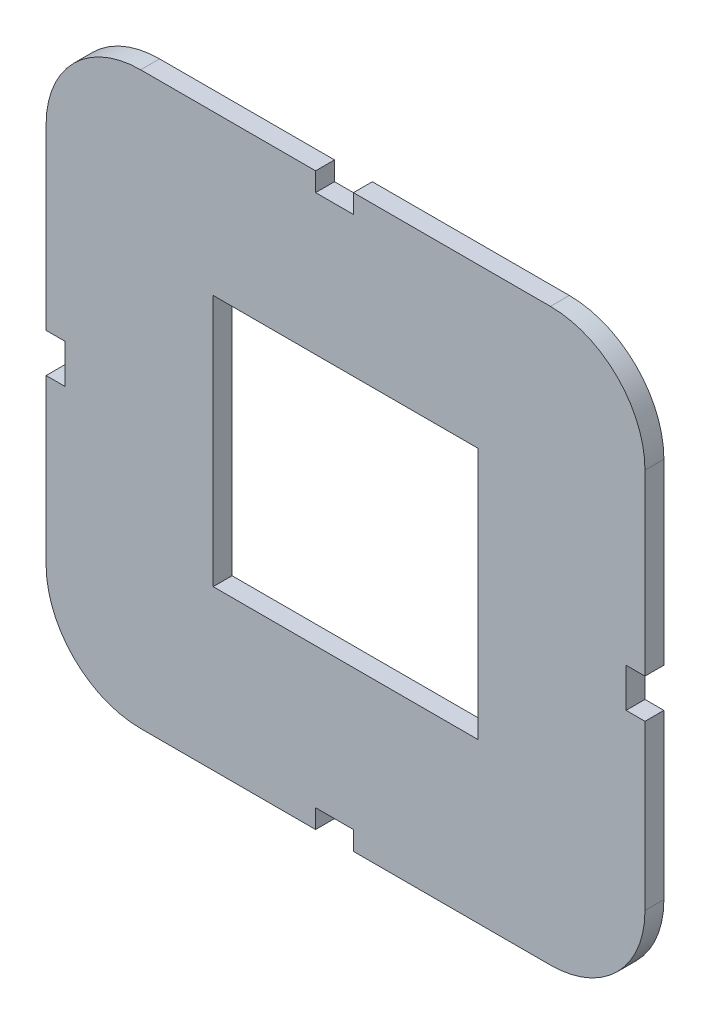
ISO-10303-21;
HEADER;
FILE_DESCRIPTION(('STEP AP214'),'2;1');
FILE_NAME('part.step','',(''),(''),'','','');
FILE_SCHEMA(('AUTOMOTIVE_DESIGN { 1 0 10303 214 1 1 1 1 }'));
ENDSEC;
DATA;
#1=APPLICATION_CONTEXT('core data for automotive mechanical design processes');
#2=APPLICATION_PROTOCOL_DEFINITION('international standard','automotive_design',2000,#1);
#3=PRODUCT_CONTEXT('',#1,'mechanical');
#4=PRODUCT('Part','Part','',(#3));
#5=PRODUCT_RELATED_PRODUCT_CATEGORY('part','',(#4));
#6=PRODUCT_DEFINITION_FORMATION('','',#4);
#7=PRODUCT_DEFINITION_CONTEXT('part definition',#1,'design');
#8=PRODUCT_DEFINITION('design','',#6,#7);
#9=PRODUCT_DEFINITION_SHAPE('','',#8);
#10=(LENGTH_UNIT() NAMED_UNIT(*) SI_UNIT(.MILLI.,.METRE.));
#11=(NAMED_UNIT(*) PLANE_ANGLE_UNIT() SI_UNIT($,.RADIAN.));
#12=(NAMED_UNIT(*) SI_UNIT($,.STERADIAN.) SOLID_ANGLE_UNIT());
#13=UNCERTAINTY_MEASURE_WITH_UNIT(LENGTH_MEASURE(1.E-05),#10,'distance_accuracy_value','');
#14=(GEOMETRIC_REPRESENTATION_CONTEXT(3) GLOBAL_UNCERTAINTY_ASSIGNED_CONTEXT((#13)) GLOBAL_UNIT_ASSIGNED_CONTEXT((#10,
#11,#12)) REPRESENTATION_CONTEXT('',''));
#15=CARTESIAN_POINT('',(0.,0.,0.));
#16=DIRECTION('',(0.,0.,1.));
#17=DIRECTION('',(1.,0.,0.));
#18=AXIS2_PLACEMENT_3D('',#15,#16,#17);
#19=CARTESIAN_POINT('',(-32.5,30.25,3.));
#20=DIRECTION('',(0.,0.,-1.));
#21=DIRECTION('',(-1.,0.,0.));
#22=AXIS2_PLACEMENT_3D('',#19,#20,#21);
#23=PLANE('',#22);
#24=DIRECTION('',(0.,-1.,0.));
#25=VECTOR('',#24,1.);
#26=CARTESIAN_POINT('',(-47.5,-30.2499999999999,3.));
#27=LINE('',#26,#25);
#28=CARTESIAN_POINT('',(-47.5,-4.25000000000001,3.));
#29=VERTEX_POINT('',#28);
#30=CARTESIAN_POINT('',(-47.5,-30.25,3.));
#31=VERTEX_POINT('',#30);
#32=EDGE_CURVE('E258',#29,#31,#27,.T.);
#33=ORIENTED_EDGE('',*,*,#32,.T.);
#34=CARTESIAN_POINT('',(-32.5,-30.25,3.));
#35=DIRECTION('',(0.,0.,1.));
#36=DIRECTION('',(-1.,0.,0.));
#37=AXIS2_PLACEMENT_3D('',#34,#35,#36);
#38=CIRCLE('',#37,15.);
#39=CARTESIAN_POINT('',(-32.4999999999999,-45.25,3.));
#40=VERTEX_POINT('',#39);
#41=EDGE_CURVE('E261',#31,#40,#38,.T.);
#42=ORIENTED_EDGE('',*,*,#41,.T.);
#43=DIRECTION('',(1.,0.,0.));
#44=VECTOR('',#43,1.);
#45=CARTESIAN_POINT('',(-32.4999999999999,-45.25,3.));
#46=LINE('',#45,#44);
#47=CARTESIAN_POINT('',(-4.75000000000001,-45.25,3.));
#48=VERTEX_POINT('',#47);
#49=EDGE_CURVE('E264',#40,#48,#46,.T.);
#50=ORIENTED_EDGE('',*,*,#49,.T.);
#51=DIRECTION('',(0.,1.,0.));
#52=VECTOR('',#51,1.);
#53=CARTESIAN_POINT('',(-4.75000000000001,-45.25,3.));
#54=LINE('',#53,#52);
#55=CARTESIAN_POINT('',(-4.75000000000001,-42.25,3.));
#56=VERTEX_POINT('',#55);
#57=EDGE_CURVE('E266',#48,#56,#54,.T.);
#58=ORIENTED_EDGE('',*,*,#57,.T.);
#59=DIRECTION('',(1.,0.,0.));
#60=VECTOR('',#59,1.);
#61=CARTESIAN_POINT('',(-4.75000000000001,-42.25,3.));
#62=LINE('',#61,#60);
#63=CARTESIAN_POINT('',(1.24999999999999,-42.25,3.));
#64=VERTEX_POINT('',#63);
#65=EDGE_CURVE('E268',#56,#64,#62,.T.);
#66=ORIENTED_EDGE('',*,*,#65,.T.);
#67=DIRECTION('',(0.,-1.,0.));
#68=VECTOR('',#67,1.);
#69=CARTESIAN_POINT('',(1.24999999999999,-42.25,3.));
#70=LINE('',#69,#68);
#71=CARTESIAN_POINT('',(1.24999999999999,-45.25,3.));
#72=VERTEX_POINT('',#71);
#73=EDGE_CURVE('E270',#64,#72,#70,.T.);
#74=ORIENTED_EDGE('',*,*,#73,.T.);
#75=DIRECTION('',(1.,0.,0.));
#76=VECTOR('',#75,1.);
#77=CARTESIAN_POINT('',(1.24999999999999,-45.25,3.));
#78=LINE('',#77,#76);
#79=CARTESIAN_POINT('',(32.4999999999999,-45.25,3.));
#80=VERTEX_POINT('',#79);
#81=EDGE_CURVE('E272',#72,#80,#78,.T.);
#82=ORIENTED_EDGE('',*,*,#81,.T.);
#83=CARTESIAN_POINT('',(32.5,-30.25,3.));
#84=DIRECTION('',(0.,0.,1.));
#85=DIRECTION('',(1.,0.,0.));
#86=AXIS2_PLACEMENT_3D('',#83,#84,#85);
#87=CIRCLE('',#86,15.);
#88=CARTESIAN_POINT('',(47.5,-30.2499999999999,3.));
#89=VERTEX_POINT('',#88);
#90=EDGE_CURVE('E274',#80,#89,#87,.T.);
#91=ORIENTED_EDGE('',*,*,#90,.T.);
#92=DIRECTION('',(0.,1.,0.));
#93=VECTOR('',#92,1.);
#94=CARTESIAN_POINT('',(47.5,-30.2499999999999,3.));
#95=LINE('',#94,#93);
#96=CARTESIAN_POINT('',(47.5,-4.25,3.));
#97=VERTEX_POINT('',#96);
#98=EDGE_CURVE('E276',#89,#97,#95,.T.);
#99=ORIENTED_EDGE('',*,*,#98,.T.);
#100=DIRECTION('',(-1.,0.,0.));
#101=VECTOR('',#100,1.);
#102=CARTESIAN_POINT('',(47.5,-4.25,3.));
#103=LINE('',#102,#101);
#104=CARTESIAN_POINT('',(44.5,-4.25,3.));
#105=VERTEX_POINT('',#104);
#106=EDGE_CURVE('E278',#97,#105,#103,.T.);
#107=ORIENTED_EDGE('',*,*,#106,.T.);
#108=DIRECTION('',(0.,1.,0.));
#109=VECTOR('',#108,1.);
#110=CARTESIAN_POINT('',(44.5,-4.25,3.));
#111=LINE('',#110,#109);
#112=CARTESIAN_POINT('',(44.5,1.95000000000002,3.));
#113=VERTEX_POINT('',#112);
#114=EDGE_CURVE('E280',#105,#113,#111,.T.);
#115=ORIENTED_EDGE('',*,*,#114,.T.);
#116=DIRECTION('',(1.,0.,0.));
#117=VECTOR('',#116,1.);
#118=CARTESIAN_POINT('',(44.5,1.95000000000002,3.));
#119=LINE('',#118,#117);
#120=CARTESIAN_POINT('',(47.5,1.95000000000002,3.));
#121=VERTEX_POINT('',#120);
#122=EDGE_CURVE('E282',#113,#121,#119,.T.);
#123=ORIENTED_EDGE('',*,*,#122,.T.);
#124=DIRECTION('',(0.,1.,0.));
#125=VECTOR('',#124,1.);
#126=CARTESIAN_POINT('',(47.5,1.95000000000002,3.));
#127=LINE('',#126,#125);
#128=CARTESIAN_POINT('',(47.5,30.2499999999999,3.));
#129=VERTEX_POINT('',#128);
#130=EDGE_CURVE('E284',#121,#129,#127,.T.);
#131=ORIENTED_EDGE('',*,*,#130,.T.);
#132=CARTESIAN_POINT('',(32.5,30.25,3.));
#133=DIRECTION('',(0.,0.,1.));
#134=DIRECTION('',(-1.,0.,0.));
#135=AXIS2_PLACEMENT_3D('',#132,#133,#134);
#136=CIRCLE('',#135,15.);
#137=CARTESIAN_POINT('',(32.4999999999999,45.25,3.));
#138=VERTEX_POINT('',#137);
#139=EDGE_CURVE('E286',#129,#138,#136,.T.);
#140=ORIENTED_EDGE('',*,*,#139,.T.);
#141=DIRECTION('',(-1.,0.,0.));
#142=VECTOR('',#141,1.);
#143=CARTESIAN_POINT('',(1.24999999999998,45.25,3.));
#144=LINE('',#143,#142);
#145=CARTESIAN_POINT('',(1.24999999999998,45.25,3.));
#146=VERTEX_POINT('',#145);
#147=EDGE_CURVE('E288',#138,#146,#144,.T.);
#148=ORIENTED_EDGE('',*,*,#147,.T.);
#149=DIRECTION('',(0.,-1.,0.));
#150=VECTOR('',#149,1.);
#151=CARTESIAN_POINT('',(1.24999999999998,42.25,3.));
#152=LINE('',#151,#150);
#153=CARTESIAN_POINT('',(1.24999999999998,42.25,3.));
#154=VERTEX_POINT('',#153);
#155=EDGE_CURVE('E290',#146,#154,#152,.T.);
#156=ORIENTED_EDGE('',*,*,#155,.T.);
#157=DIRECTION('',(-1.,0.,0.));
#158=VECTOR('',#157,1.);
#159=CARTESIAN_POINT('',(-4.75000000000002,42.25,3.));
#160=LINE('',#159,#158);
#161=CARTESIAN_POINT('',(-4.75000000000002,42.25,3.));
#162=VERTEX_POINT('',#161);
#163=EDGE_CURVE('E292',#154,#162,#160,.T.);
#164=ORIENTED_EDGE('',*,*,#163,.T.);
#165=DIRECTION('',(0.,1.,0.));
#166=VECTOR('',#165,1.);
#167=CARTESIAN_POINT('',(-4.75000000000002,45.25,3.));
#168=LINE('',#167,#166);
#169=CARTESIAN_POINT('',(-4.75000000000002,45.25,3.));
#170=VERTEX_POINT('',#169);
#171=EDGE_CURVE('E294',#162,#170,#168,.T.);
#172=ORIENTED_EDGE('',*,*,#171,.T.);
#173=DIRECTION('',(-1.,0.,0.));
#174=VECTOR('',#173,1.);
#175=CARTESIAN_POINT('',(-32.4999999999999,45.25,3.));
#176=LINE('',#175,#174);
#177=CARTESIAN_POINT('',(-32.4999999999999,45.25,3.));
#178=VERTEX_POINT('',#177);
#179=EDGE_CURVE('E296',#170,#178,#176,.T.);
#180=ORIENTED_EDGE('',*,*,#179,.T.);
#181=CARTESIAN_POINT('',(-32.5,30.25,3.));
#182=DIRECTION('',(0.,0.,1.));
#183=DIRECTION('',(-1.,0.,0.));
#184=AXIS2_PLACEMENT_3D('',#181,#182,#183);
#185=CIRCLE('',#184,15.);
#186=CARTESIAN_POINT('',(-47.5,30.2499999999999,3.));
#187=VERTEX_POINT('',#186);
#188=EDGE_CURVE('E298',#178,#187,#185,.T.);
#189=ORIENTED_EDGE('',*,*,#188,.T.);
#190=DIRECTION('',(0.,-1.,0.));
#191=VECTOR('',#190,1.);
#192=CARTESIAN_POINT('',(-47.5,1.95000000000004,3.));
#193=LINE('',#192,#191);
#194=CARTESIAN_POINT('',(-47.5,1.95000000000004,3.));
#195=VERTEX_POINT('',#194);
#196=EDGE_CURVE('E300',#187,#195,#193,.T.);
#197=ORIENTED_EDGE('',*,*,#196,.T.);
#198=DIRECTION('',(1.,0.,0.));
#199=VECTOR('',#198,1.);
#200=CARTESIAN_POINT('',(-44.5,1.95000000000001,3.));
#201=LINE('',#200,#199);
#202=CARTESIAN_POINT('',(-44.5,1.95000000000001,3.));
#203=VERTEX_POINT('',#202);
#204=EDGE_CURVE('E302',#195,#203,#201,.T.);
#205=ORIENTED_EDGE('',*,*,#204,.T.);
#206=DIRECTION('',(0.,-1.,0.));
#207=VECTOR('',#206,1.);
#208=CARTESIAN_POINT('',(-44.5,-4.24999999999998,3.));
#209=LINE('',#208,#207);
#210=CARTESIAN_POINT('',(-44.5,-4.24999999999998,3.));
#211=VERTEX_POINT('',#210);
#212=EDGE_CURVE('E304',#203,#211,#209,.T.);
#213=ORIENTED_EDGE('',*,*,#212,.T.);
#214=DIRECTION('',(-1.,0.,0.));
#215=VECTOR('',#214,1.);
#216=CARTESIAN_POINT('',(-47.5,-4.25000000000001,3.));
#217=LINE('',#216,#215);
#218=EDGE_CURVE('E306',#211,#29,#217,.T.);
#219=ORIENTED_EDGE('',*,*,#218,.T.);
#220=EDGE_LOOP('',(#33,#42,#50,#58,#66,#74,#82,#91,#99,#107,#115,#123,#131,#140,#148,#156,#164,
#172,#180,#189,#197,#205,#213,#219));
#221=FACE_BOUND('',#220,.T.);
#222=DIRECTION('',(0.,-1.,0.));
#223=VECTOR('',#222,1.);
#224=CARTESIAN_POINT('',(-21.,20.0052631578947,3.));
#225=LINE('',#224,#223);
#226=CARTESIAN_POINT('',(-21.,20.0052631578947,3.));
#227=VERTEX_POINT('',#226);
#228=CARTESIAN_POINT('',(-21.,-20.0052631578947,3.));
#229=VERTEX_POINT('',#228);
#230=EDGE_CURVE('E222',#227,#229,#225,.T.);
#231=ORIENTED_EDGE('',*,*,#230,.F.);
#232=DIRECTION('',(-1.,0.,0.));
#233=VECTOR('',#232,1.);
#234=CARTESIAN_POINT('',(21.,20.0052631578947,3.));
#235=LINE('',#234,#233);
#236=CARTESIAN_POINT('',(21.,20.0052631578947,3.));
#237=VERTEX_POINT('',#236);
#238=EDGE_CURVE('E244',#237,#227,#235,.T.);
#239=ORIENTED_EDGE('',*,*,#238,.F.);
#240=DIRECTION('',(0.,1.,0.));
#241=VECTOR('',#240,1.);
#242=CARTESIAN_POINT('',(21.,20.0052631578947,3.));
#243=LINE('',#242,#241);
#244=CARTESIAN_POINT('',(21.,-20.0052631578947,3.));
#245=VERTEX_POINT('',#244);
#246=EDGE_CURVE('E242',#245,#237,#243,.T.);
#247=ORIENTED_EDGE('',*,*,#246,.F.);
#248=DIRECTION('',(1.,0.,0.));
#249=VECTOR('',#248,1.);
#250=CARTESIAN_POINT('',(21.,-20.0052631578947,3.));
#251=LINE('',#250,#249);
#252=EDGE_CURVE('E230',#229,#245,#251,.T.);
#253=ORIENTED_EDGE('',*,*,#252,.F.);
#254=EDGE_LOOP('',(#231,#239,#247,#253));
#255=FACE_BOUND('',#254,.T.);
#256=ADVANCED_FACE('F37',(#221,#255),#23,.F.);
#257=CARTESIAN_POINT('',(-32.5,30.25,0.));
#258=DIRECTION('',(0.,0.,-1.));
#259=DIRECTION('',(-1.,0.,0.));
#260=AXIS2_PLACEMENT_3D('',#257,#258,#259);
#261=PLANE('',#260);
#262=DIRECTION('',(0.,-1.,0.));
#263=VECTOR('',#262,1.);
#264=CARTESIAN_POINT('',(-47.5,-30.2499999999999,0.));
#265=LINE('',#264,#263);
#266=CARTESIAN_POINT('',(-47.5,-4.25000000000001,0.));
#267=VERTEX_POINT('',#266);
#268=CARTESIAN_POINT('',(-47.5,-30.25,0.));
#269=VERTEX_POINT('',#268);
#270=EDGE_CURVE('E238',#267,#269,#265,.T.);
#271=ORIENTED_EDGE('',*,*,#270,.F.);
#272=DIRECTION('',(-1.,0.,0.));
#273=VECTOR('',#272,1.);
#274=CARTESIAN_POINT('',(-47.5,-4.25000000000001,0.));
#275=LINE('',#274,#273);
#276=CARTESIAN_POINT('',(-44.5,-4.24999999999998,0.));
#277=VERTEX_POINT('',#276);
#278=EDGE_CURVE('E262',#277,#267,#275,.T.);
#279=ORIENTED_EDGE('',*,*,#278,.F.);
#280=DIRECTION('',(0.,-1.,0.));
#281=VECTOR('',#280,1.);
#282=CARTESIAN_POINT('',(-44.5,-4.24999999999998,0.));
#283=LINE('',#282,#281);
#284=CARTESIAN_POINT('',(-44.5,1.95000000000001,0.));
#285=VERTEX_POINT('',#284);
#286=EDGE_CURVE('E353',#285,#277,#283,.T.);
#287=ORIENTED_EDGE('',*,*,#286,.F.);
#288=DIRECTION('',(1.,0.,0.));
#289=VECTOR('',#288,1.);
#290=CARTESIAN_POINT('',(-44.5,1.95000000000001,0.));
#291=LINE('',#290,#289);
#292=CARTESIAN_POINT('',(-47.5,1.95000000000004,0.));
#293=VERTEX_POINT('',#292);
#294=EDGE_CURVE('E351',#293,#285,#291,.T.);
#295=ORIENTED_EDGE('',*,*,#294,.F.);
#296=DIRECTION('',(0.,-1.,0.));
#297=VECTOR('',#296,1.);
#298=CARTESIAN_POINT('',(-47.5,1.95000000000004,0.));
#299=LINE('',#298,#297);
#300=CARTESIAN_POINT('',(-47.5,30.2499999999999,0.));
#301=VERTEX_POINT('',#300);
#302=EDGE_CURVE('E349',#301,#293,#299,.T.);
#303=ORIENTED_EDGE('',*,*,#302,.F.);
#304=CARTESIAN_POINT('',(-32.5,30.25,0.));
#305=DIRECTION('',(0.,0.,1.));
#306=DIRECTION('',(-1.,0.,0.));
#307=AXIS2_PLACEMENT_3D('',#304,#305,#306);
#308=CIRCLE('',#307,15.);
#309=CARTESIAN_POINT('',(-32.4999999999999,45.25,0.));
#310=VERTEX_POINT('',#309);
#311=EDGE_CURVE('E347',#310,#301,#308,.T.);
#312=ORIENTED_EDGE('',*,*,#311,.F.);
#313=DIRECTION('',(-1.,0.,0.));
#314=VECTOR('',#313,1.);
#315=CARTESIAN_POINT('',(-32.4999999999999,45.25,0.));
#316=LINE('',#315,#314);
#317=CARTESIAN_POINT('',(-4.75000000000002,45.25,0.));
#318=VERTEX_POINT('',#317);
#319=EDGE_CURVE('E345',#318,#310,#316,.T.);
#320=ORIENTED_EDGE('',*,*,#319,.F.);
#321=DIRECTION('',(0.,1.,0.));
#322=VECTOR('',#321,1.);
#323=CARTESIAN_POINT('',(-4.75000000000002,45.25,0.));
#324=LINE('',#323,#322);
#325=CARTESIAN_POINT('',(-4.75000000000002,42.25,0.));
#326=VERTEX_POINT('',#325);
#327=EDGE_CURVE('E343',#326,#318,#324,.T.);
#328=ORIENTED_EDGE('',*,*,#327,.F.);
#329=DIRECTION('',(-1.,0.,0.));
#330=VECTOR('',#329,1.);
#331=CARTESIAN_POINT('',(-4.75000000000002,42.25,0.));
#332=LINE('',#331,#330);
#333=CARTESIAN_POINT('',(1.24999999999998,42.25,0.));
#334=VERTEX_POINT('',#333);
#335=EDGE_CURVE('E341',#334,#326,#332,.T.);
#336=ORIENTED_EDGE('',*,*,#335,.F.);
#337=DIRECTION('',(0.,-1.,0.));
#338=VECTOR('',#337,1.);
#339=CARTESIAN_POINT('',(1.24999999999998,42.25,0.));
#340=LINE('',#339,#338);
#341=CARTESIAN_POINT('',(1.24999999999998,45.25,0.));
#342=VERTEX_POINT('',#341);
#343=EDGE_CURVE('E339',#342,#334,#340,.T.);
#344=ORIENTED_EDGE('',*,*,#343,.F.);
#345=DIRECTION('',(-1.,0.,0.));
#346=VECTOR('',#345,1.);
#347=CARTESIAN_POINT('',(1.24999999999998,45.25,0.));
#348=LINE('',#347,#346);
#349=CARTESIAN_POINT('',(32.4999999999999,45.25,0.));
#350=VERTEX_POINT('',#349);
#351=EDGE_CURVE('E337',#350,#342,#348,.T.);
#352=ORIENTED_EDGE('',*,*,#351,.F.);
#353=CARTESIAN_POINT('',(32.5,30.25,0.));
#354=DIRECTION('',(0.,0.,1.));
#355=DIRECTION('',(-1.,0.,0.));
#356=AXIS2_PLACEMENT_3D('',#353,#354,#355);
#357=CIRCLE('',#356,15.);
#358=CARTESIAN_POINT('',(47.5,30.2499999999999,0.));
#359=VERTEX_POINT('',#358);
#360=EDGE_CURVE('E335',#359,#350,#357,.T.);
#361=ORIENTED_EDGE('',*,*,#360,.F.);
#362=DIRECTION('',(0.,1.,0.));
#363=VECTOR('',#362,1.);
#364=CARTESIAN_POINT('',(47.5,1.95000000000002,0.));
#365=LINE('',#364,#363);
#366=CARTESIAN_POINT('',(47.5,1.95000000000002,0.));
#367=VERTEX_POINT('',#366);
#368=EDGE_CURVE('E333',#367,#359,#365,.T.);
#369=ORIENTED_EDGE('',*,*,#368,.F.);
#370=DIRECTION('',(1.,0.,0.));
#371=VECTOR('',#370,1.);
#372=CARTESIAN_POINT('',(44.5,1.95000000000002,0.));
#373=LINE('',#372,#371);
#374=CARTESIAN_POINT('',(44.5,1.95000000000002,0.));
#375=VERTEX_POINT('',#374);
#376=EDGE_CURVE('E331',#375,#367,#373,.T.);
#377=ORIENTED_EDGE('',*,*,#376,.F.);
#378=DIRECTION('',(0.,1.,0.));
#379=VECTOR('',#378,1.);
#380=CARTESIAN_POINT('',(44.5,-4.25,0.));
#381=LINE('',#380,#379);
#382=CARTESIAN_POINT('',(44.5,-4.25,0.));
#383=VERTEX_POINT('',#382);
#384=EDGE_CURVE('E329',#383,#375,#381,.T.);
#385=ORIENTED_EDGE('',*,*,#384,.F.);
#386=DIRECTION('',(-1.,0.,0.));
#387=VECTOR('',#386,1.);
#388=CARTESIAN_POINT('',(47.5,-4.25,0.));
#389=LINE('',#388,#387);
#390=CARTESIAN_POINT('',(47.5,-4.25,0.));
#391=VERTEX_POINT('',#390);
#392=EDGE_CURVE('E327',#391,#383,#389,.T.);
#393=ORIENTED_EDGE('',*,*,#392,.F.);
#394=DIRECTION('',(0.,1.,0.));
#395=VECTOR('',#394,1.);
#396=CARTESIAN_POINT('',(47.5,-30.2499999999999,0.));
#397=LINE('',#396,#395);
#398=CARTESIAN_POINT('',(47.5,-30.2499999999999,0.));
#399=VERTEX_POINT('',#398);
#400=EDGE_CURVE('E325',#399,#391,#397,.T.);
#401=ORIENTED_EDGE('',*,*,#400,.F.);
#402=CARTESIAN_POINT('',(32.5,-30.25,0.));
#403=DIRECTION('',(0.,0.,1.));
#404=DIRECTION('',(1.,0.,0.));
#405=AXIS2_PLACEMENT_3D('',#402,#403,#404);
#406=CIRCLE('',#405,15.);
#407=CARTESIAN_POINT('',(32.4999999999999,-45.25,0.));
#408=VERTEX_POINT('',#407);
#409=EDGE_CURVE('E323',#408,#399,#406,.T.);
#410=ORIENTED_EDGE('',*,*,#409,.F.);
#411=DIRECTION('',(1.,0.,0.));
#412=VECTOR('',#411,1.);
#413=CARTESIAN_POINT('',(1.24999999999999,-45.25,0.));
#414=LINE('',#413,#412);
#415=CARTESIAN_POINT('',(1.24999999999999,-45.25,0.));
#416=VERTEX_POINT('',#415);
#417=EDGE_CURVE('E321',#416,#408,#414,.T.);
#418=ORIENTED_EDGE('',*,*,#417,.F.);
#419=DIRECTION('',(0.,-1.,0.));
#420=VECTOR('',#419,1.);
#421=CARTESIAN_POINT('',(1.24999999999999,-42.25,0.));
#422=LINE('',#421,#420);
#423=CARTESIAN_POINT('',(1.24999999999999,-42.25,0.));
#424=VERTEX_POINT('',#423);
#425=EDGE_CURVE('E319',#424,#416,#422,.T.);
#426=ORIENTED_EDGE('',*,*,#425,.F.);
#427=DIRECTION('',(1.,0.,0.));
#428=VECTOR('',#427,1.);
#429=CARTESIAN_POINT('',(-4.75000000000001,-42.25,0.));
#430=LINE('',#429,#428);
#431=CARTESIAN_POINT('',(-4.75000000000001,-42.25,0.));
#432=VERTEX_POINT('',#431);
#433=EDGE_CURVE('E317',#432,#424,#430,.T.);
#434=ORIENTED_EDGE('',*,*,#433,.F.);
#435=DIRECTION('',(0.,1.,0.));
#436=VECTOR('',#435,1.);
#437=CARTESIAN_POINT('',(-4.75000000000001,-45.25,0.));
#438=LINE('',#437,#436);
#439=CARTESIAN_POINT('',(-4.75000000000001,-45.25,0.));
#440=VERTEX_POINT('',#439);
#441=EDGE_CURVE('E315',#440,#432,#438,.T.);
#442=ORIENTED_EDGE('',*,*,#441,.F.);
#443=DIRECTION('',(1.,0.,0.));
#444=VECTOR('',#443,1.);
#445=CARTESIAN_POINT('',(-32.4999999999999,-45.25,0.));
#446=LINE('',#445,#444);
#447=CARTESIAN_POINT('',(-32.4999999999999,-45.25,0.));
#448=VERTEX_POINT('',#447);
#449=EDGE_CURVE('E313',#448,#440,#446,.T.);
#450=ORIENTED_EDGE('',*,*,#449,.F.);
#451=CARTESIAN_POINT('',(-32.5,-30.25,0.));
#452=DIRECTION('',(0.,0.,1.));
#453=DIRECTION('',(-1.,0.,0.));
#454=AXIS2_PLACEMENT_3D('',#451,#452,#453);
#455=CIRCLE('',#454,15.);
#456=EDGE_CURVE('E311',#269,#448,#455,.T.);
#457=ORIENTED_EDGE('',*,*,#456,.F.);
#458=EDGE_LOOP('',(#271,#279,#287,#295,#303,#312,#320,#328,#336,#344,#352,#361,#369,#377,#385,
#393,#401,#410,#418,#426,#434,#442,#450,#457));
#459=FACE_BOUND('',#458,.T.);
#460=DIRECTION('',(-1.,0.,0.));
#461=VECTOR('',#460,1.);
#462=CARTESIAN_POINT('',(21.,20.0052631578947,0.));
#463=LINE('',#462,#461);
#464=CARTESIAN_POINT('',(21.,20.0052631578947,0.));
#465=VERTEX_POINT('',#464);
#466=CARTESIAN_POINT('',(-21.,20.0052631578947,0.));
#467=VERTEX_POINT('',#466);
#468=EDGE_CURVE('E231',#465,#467,#463,.T.);
#469=ORIENTED_EDGE('',*,*,#468,.T.);
#470=DIRECTION('',(0.,-1.,0.));
#471=VECTOR('',#470,1.);
#472=CARTESIAN_POINT('',(-21.,20.0052631578947,0.));
#473=LINE('',#472,#471);
#474=CARTESIAN_POINT('',(-21.,-20.0052631578947,0.));
#475=VERTEX_POINT('',#474);
#476=EDGE_CURVE('E60',#467,#475,#473,.T.);
#477=ORIENTED_EDGE('',*,*,#476,.T.);
#478=DIRECTION('',(1.,0.,0.));
#479=VECTOR('',#478,1.);
#480=CARTESIAN_POINT('',(21.,-20.0052631578947,0.));
#481=LINE('',#480,#479);
#482=CARTESIAN_POINT('',(21.,-20.0052631578947,0.));
#483=VERTEX_POINT('',#482);
#484=EDGE_CURVE('E237',#475,#483,#481,.T.);
#485=ORIENTED_EDGE('',*,*,#484,.T.);
#486=DIRECTION('',(0.,1.,0.));
#487=VECTOR('',#486,1.);
#488=CARTESIAN_POINT('',(21.,20.0052631578947,0.));
#489=LINE('',#488,#487);
#490=EDGE_CURVE('E250',#483,#465,#489,.T.);
#491=ORIENTED_EDGE('',*,*,#490,.T.);
#492=EDGE_LOOP('',(#469,#477,#485,#491));
#493=FACE_BOUND('',#492,.T.);
#494=ADVANCED_FACE('F431',(#459,#493),#261,.T.);
#495=CARTESIAN_POINT('',(-47.5,-30.2499999999999,3.));
#496=DIRECTION('',(1.,0.,0.));
#497=DIRECTION('',(0.,1.,0.));
#498=AXIS2_PLACEMENT_3D('',#495,#496,#497);
#499=PLANE('',#498);
#500=ORIENTED_EDGE('',*,*,#270,.T.);
#501=DIRECTION('',(0.,0.,-1.));
#502=VECTOR('',#501,1.);
#503=CARTESIAN_POINT('',(-47.5,-30.25,3.));
#504=LINE('',#503,#502);
#505=EDGE_CURVE('E11',#31,#269,#504,.T.);
#506=ORIENTED_EDGE('',*,*,#505,.F.);
#507=ORIENTED_EDGE('',*,*,#32,.F.);
#508=DIRECTION('',(0.,0.,-1.));
#509=VECTOR('',#508,1.);
#510=CARTESIAN_POINT('',(-47.5,-4.25000000000001,3.));
#511=LINE('',#510,#509);
#512=EDGE_CURVE('E308',#29,#267,#511,.T.);
#513=ORIENTED_EDGE('',*,*,#512,.T.);
#514=EDGE_LOOP('',(#500,#506,#507,#513));
#515=FACE_BOUND('',#514,.T.);
#516=ADVANCED_FACE('F39',(#515),#499,.F.);
#517=CARTESIAN_POINT('',(-32.5,-30.25,3.));
#518=DIRECTION('',(0.,0.,-1.));
#519=DIRECTION('',(-1.,0.,0.));
#520=AXIS2_PLACEMENT_3D('',#517,#518,#519);
#521=CYLINDRICAL_SURFACE('',#520,15.);
#522=ORIENTED_EDGE('',*,*,#456,.T.);
#523=DIRECTION('',(0.,0.,-1.));
#524=VECTOR('',#523,1.);
#525=CARTESIAN_POINT('',(-32.4999999999999,-45.25,3.));
#526=LINE('',#525,#524);
#527=EDGE_CURVE('E45',#40,#448,#526,.T.);
#528=ORIENTED_EDGE('',*,*,#527,.F.);
#529=ORIENTED_EDGE('',*,*,#41,.F.);
#530=ORIENTED_EDGE('',*,*,#505,.T.);
#531=EDGE_LOOP('',(#522,#528,#529,#530));
#532=FACE_BOUND('',#531,.T.);
#533=ADVANCED_FACE('F448',(#532),#521,.T.);
#534=CARTESIAN_POINT('',(-32.4999999999999,-45.25,3.));
#535=DIRECTION('',(0.,1.,0.));
#536=DIRECTION('',(-1.,0.,0.));
#537=AXIS2_PLACEMENT_3D('',#534,#535,#536);
#538=PLANE('',#537);
#539=ORIENTED_EDGE('',*,*,#449,.T.);
#540=DIRECTION('',(0.,0.,-1.));
#541=VECTOR('',#540,1.);
#542=CARTESIAN_POINT('',(-4.75000000000001,-45.25,3.));
#543=LINE('',#542,#541);
#544=EDGE_CURVE('E418',#48,#440,#543,.T.);
#545=ORIENTED_EDGE('',*,*,#544,.F.);
#546=ORIENTED_EDGE('',*,*,#49,.F.);
#547=ORIENTED_EDGE('',*,*,#527,.T.);
#548=EDGE_LOOP('',(#539,#545,#546,#547));
#549=FACE_BOUND('',#548,.T.);
#550=ADVANCED_FACE('F425',(#549),#538,.F.);
#551=CARTESIAN_POINT('',(-4.75000000000001,-45.25,3.));
#552=DIRECTION('',(-1.,0.,0.));
#553=DIRECTION('',(0.,0.,1.));
#554=AXIS2_PLACEMENT_3D('',#551,#552,#553);
#555=PLANE('',#554);
#556=ORIENTED_EDGE('',*,*,#441,.T.);
#557=DIRECTION('',(0.,0.,-1.));
#558=VECTOR('',#557,1.);
#559=CARTESIAN_POINT('',(-4.75000000000001,-42.25,3.));
#560=LINE('',#559,#558);
#561=EDGE_CURVE('E415',#56,#432,#560,.T.);
#562=ORIENTED_EDGE('',*,*,#561,.F.);
#563=ORIENTED_EDGE('',*,*,#57,.F.);
#564=ORIENTED_EDGE('',*,*,#544,.T.);
#565=EDGE_LOOP('',(#556,#562,#563,#564));
#566=FACE_BOUND('',#565,.T.);
#567=ADVANCED_FACE('F437',(#566),#555,.F.);
#568=CARTESIAN_POINT('',(-4.75000000000001,-42.25,3.));
#569=DIRECTION('',(0.,1.,0.));
#570=DIRECTION('',(0.,0.,1.));
#571=AXIS2_PLACEMENT_3D('',#568,#569,#570);
#572=PLANE('',#571);
#573=ORIENTED_EDGE('',*,*,#433,.T.);
#574=DIRECTION('',(0.,0.,-1.));
#575=VECTOR('',#574,1.);
#576=CARTESIAN_POINT('',(1.24999999999999,-42.25,3.));
#577=LINE('',#576,#575);
#578=EDGE_CURVE('E412',#64,#424,#577,.T.);
#579=ORIENTED_EDGE('',*,*,#578,.F.);
#580=ORIENTED_EDGE('',*,*,#65,.F.);
#581=ORIENTED_EDGE('',*,*,#561,.T.);
#582=EDGE_LOOP('',(#573,#579,#580,#581));
#583=FACE_BOUND('',#582,.T.);
#584=ADVANCED_FACE('F441',(#583),#572,.F.);
#585=CARTESIAN_POINT('',(1.24999999999999,-42.25,3.));
#586=DIRECTION('',(1.,0.,0.));
#587=DIRECTION('',(0.,1.,0.));
#588=AXIS2_PLACEMENT_3D('',#585,#586,#587);
#589=PLANE('',#588);
#590=ORIENTED_EDGE('',*,*,#425,.T.);
#591=DIRECTION('',(0.,0.,-1.));
#592=VECTOR('',#591,1.);
#593=CARTESIAN_POINT('',(1.24999999999999,-45.25,3.));
#594=LINE('',#593,#592);
#595=EDGE_CURVE('E409',#72,#416,#594,.T.);
#596=ORIENTED_EDGE('',*,*,#595,.F.);
#597=ORIENTED_EDGE('',*,*,#73,.F.);
#598=ORIENTED_EDGE('',*,*,#578,.T.);
#599=EDGE_LOOP('',(#590,#596,#597,#598));
#600=FACE_BOUND('',#599,.T.);
#601=ADVANCED_FACE('F541',(#600),#589,.F.);
#602=CARTESIAN_POINT('',(1.24999999999999,-45.25,3.));
#603=DIRECTION('',(0.,1.,0.));
#604=DIRECTION('',(-1.,0.,0.));
#605=AXIS2_PLACEMENT_3D('',#602,#603,#604);
#606=PLANE('',#605);
#607=ORIENTED_EDGE('',*,*,#417,.T.);
#608=DIRECTION('',(0.,0.,-1.));
#609=VECTOR('',#608,1.);
#610=CARTESIAN_POINT('',(32.4999999999999,-45.25,3.));
#611=LINE('',#610,#609);
#612=EDGE_CURVE('E406',#80,#408,#611,.T.);
#613=ORIENTED_EDGE('',*,*,#612,.F.);
#614=ORIENTED_EDGE('',*,*,#81,.F.);
#615=ORIENTED_EDGE('',*,*,#595,.T.);
#616=EDGE_LOOP('',(#607,#613,#614,#615));
#617=FACE_BOUND('',#616,.T.);
#618=ADVANCED_FACE('F539',(#617),#606,.F.);
#619=CARTESIAN_POINT('',(32.5,-30.25,3.));
#620=DIRECTION('',(0.,0.,-1.));
#621=DIRECTION('',(-1.,0.,0.));
#622=AXIS2_PLACEMENT_3D('',#619,#620,#621);
#623=CYLINDRICAL_SURFACE('',#622,15.);
#624=ORIENTED_EDGE('',*,*,#409,.T.);
#625=DIRECTION('',(0.,0.,-1.));
#626=VECTOR('',#625,1.);
#627=CARTESIAN_POINT('',(47.5,-30.2499999999999,3.));
#628=LINE('',#627,#626);
#629=EDGE_CURVE('E403',#89,#399,#628,.T.);
#630=ORIENTED_EDGE('',*,*,#629,.F.);
#631=ORIENTED_EDGE('',*,*,#90,.F.);
#632=ORIENTED_EDGE('',*,*,#612,.T.);
#633=EDGE_LOOP('',(#624,#630,#631,#632));
#634=FACE_BOUND('',#633,.T.);
#635=ADVANCED_FACE('F535',(#634),#623,.T.);
#636=CARTESIAN_POINT('',(47.5,-30.2499999999999,3.));
#637=DIRECTION('',(-1.,0.,0.));
#638=DIRECTION('',(0.,-1.,0.));
#639=AXIS2_PLACEMENT_3D('',#636,#637,#638);
#640=PLANE('',#639);
#641=ORIENTED_EDGE('',*,*,#400,.T.);
#642=DIRECTION('',(0.,0.,-1.));
#643=VECTOR('',#642,1.);
#644=CARTESIAN_POINT('',(47.5,-4.25,3.));
#645=LINE('',#644,#643);
#646=EDGE_CURVE('E400',#97,#391,#645,.T.);
#647=ORIENTED_EDGE('',*,*,#646,.F.);
#648=ORIENTED_EDGE('',*,*,#98,.F.);
#649=ORIENTED_EDGE('',*,*,#629,.T.);
#650=EDGE_LOOP('',(#641,#647,#648,#649));
#651=FACE_BOUND('',#650,.T.);
#652=ADVANCED_FACE('F530',(#651),#640,.F.);
#653=CARTESIAN_POINT('',(47.5,-4.25,3.));
#654=DIRECTION('',(0.,-1.,0.));
#655=DIRECTION('',(0.,0.,-1.));
#656=AXIS2_PLACEMENT_3D('',#653,#654,#655);
#657=PLANE('',#656);
#658=ORIENTED_EDGE('',*,*,#392,.T.);
#659=DIRECTION('',(0.,0.,-1.));
#660=VECTOR('',#659,1.);
#661=CARTESIAN_POINT('',(44.5,-4.25,3.));
#662=LINE('',#661,#660);
#663=EDGE_CURVE('E397',#105,#383,#662,.T.);
#664=ORIENTED_EDGE('',*,*,#663,.F.);
#665=ORIENTED_EDGE('',*,*,#106,.F.);
#666=ORIENTED_EDGE('',*,*,#646,.T.);
#667=EDGE_LOOP('',(#658,#664,#665,#666));
#668=FACE_BOUND('',#667,.T.);
#669=ADVANCED_FACE('F524',(#668),#657,.F.);
#670=CARTESIAN_POINT('',(44.5,-4.25,3.));
#671=DIRECTION('',(-1.,0.,0.));
#672=DIRECTION('',(0.,0.,1.));
#673=AXIS2_PLACEMENT_3D('',#670,#671,#672);
#674=PLANE('',#673);
#675=ORIENTED_EDGE('',*,*,#384,.T.);
#676=DIRECTION('',(0.,0.,-1.));
#677=VECTOR('',#676,1.);
#678=CARTESIAN_POINT('',(44.5,1.95000000000002,3.));
#679=LINE('',#678,#677);
#680=EDGE_CURVE('E394',#113,#375,#679,.T.);
#681=ORIENTED_EDGE('',*,*,#680,.F.);
#682=ORIENTED_EDGE('',*,*,#114,.F.);
#683=ORIENTED_EDGE('',*,*,#663,.T.);
#684=EDGE_LOOP('',(#675,#681,#682,#683));
#685=FACE_BOUND('',#684,.T.);
#686=ADVANCED_FACE('F520',(#685),#674,.F.);
#687=CARTESIAN_POINT('',(44.5,1.95000000000002,3.));
#688=DIRECTION('',(0.,1.,0.));
#689=DIRECTION('',(0.,0.,1.));
#690=AXIS2_PLACEMENT_3D('',#687,#688,#689);
#691=PLANE('',#690);
#692=ORIENTED_EDGE('',*,*,#376,.T.);
#693=DIRECTION('',(0.,0.,-1.));
#694=VECTOR('',#693,1.);
#695=CARTESIAN_POINT('',(47.5,1.95000000000002,3.));
#696=LINE('',#695,#694);
#697=EDGE_CURVE('E391',#121,#367,#696,.T.);
#698=ORIENTED_EDGE('',*,*,#697,.F.);
#699=ORIENTED_EDGE('',*,*,#122,.F.);
#700=ORIENTED_EDGE('',*,*,#680,.T.);
#701=EDGE_LOOP('',(#692,#698,#699,#700));
#702=FACE_BOUND('',#701,.T.);
#703=ADVANCED_FACE('F515',(#702),#691,.F.);
#704=CARTESIAN_POINT('',(47.5,1.95000000000002,3.));
#705=DIRECTION('',(-1.,0.,0.));
#706=DIRECTION('',(0.,-1.,0.));
#707=AXIS2_PLACEMENT_3D('',#704,#705,#706);
#708=PLANE('',#707);
#709=ORIENTED_EDGE('',*,*,#368,.T.);
#710=DIRECTION('',(0.,0.,-1.));
#711=VECTOR('',#710,1.);
#712=CARTESIAN_POINT('',(47.5,30.2499999999999,3.));
#713=LINE('',#712,#711);
#714=EDGE_CURVE('E388',#129,#359,#713,.T.);
#715=ORIENTED_EDGE('',*,*,#714,.F.);
#716=ORIENTED_EDGE('',*,*,#130,.F.);
#717=ORIENTED_EDGE('',*,*,#697,.T.);
#718=EDGE_LOOP('',(#709,#715,#716,#717));
#719=FACE_BOUND('',#718,.T.);
#720=ADVANCED_FACE('F509',(#719),#708,.F.);
#721=CARTESIAN_POINT('',(32.5,30.25,3.));
#722=DIRECTION('',(0.,0.,-1.));
#723=DIRECTION('',(-1.,0.,0.));
#724=AXIS2_PLACEMENT_3D('',#721,#722,#723);
#725=CYLINDRICAL_SURFACE('',#724,15.);
#726=ORIENTED_EDGE('',*,*,#360,.T.);
#727=DIRECTION('',(0.,0.,-1.));
#728=VECTOR('',#727,1.);
#729=CARTESIAN_POINT('',(32.4999999999999,45.25,3.));
#730=LINE('',#729,#728);
#731=EDGE_CURVE('E385',#138,#350,#730,.T.);
#732=ORIENTED_EDGE('',*,*,#731,.F.);
#733=ORIENTED_EDGE('',*,*,#139,.F.);
#734=ORIENTED_EDGE('',*,*,#714,.T.);
#735=EDGE_LOOP('',(#726,#732,#733,#734));
#736=FACE_BOUND('',#735,.T.);
#737=ADVANCED_FACE('F505',(#736),#725,.T.);
#738=CARTESIAN_POINT('',(1.24999999999998,45.25,3.));
#739=DIRECTION('',(0.,-1.,0.));
#740=DIRECTION('',(1.,0.,0.));
#741=AXIS2_PLACEMENT_3D('',#738,#739,#740);
#742=PLANE('',#741);
#743=ORIENTED_EDGE('',*,*,#351,.T.);
#744=DIRECTION('',(0.,0.,-1.));
#745=VECTOR('',#744,1.);
#746=CARTESIAN_POINT('',(1.24999999999998,45.25,3.));
#747=LINE('',#746,#745);
#748=EDGE_CURVE('E382',#146,#342,#747,.T.);
#749=ORIENTED_EDGE('',*,*,#748,.F.);
#750=ORIENTED_EDGE('',*,*,#147,.F.);
#751=ORIENTED_EDGE('',*,*,#731,.T.);
#752=EDGE_LOOP('',(#743,#749,#750,#751));
#753=FACE_BOUND('',#752,.T.);
#754=ADVANCED_FACE('F500',(#753),#742,.F.);
#755=CARTESIAN_POINT('',(1.24999999999998,42.25,3.));
#756=DIRECTION('',(1.,0.,0.));
#757=DIRECTION('',(0.,1.,0.));
#758=AXIS2_PLACEMENT_3D('',#755,#756,#757);
#759=PLANE('',#758);
#760=ORIENTED_EDGE('',*,*,#343,.T.);
#761=DIRECTION('',(0.,0.,-1.));
#762=VECTOR('',#761,1.);
#763=CARTESIAN_POINT('',(1.24999999999998,42.25,3.));
#764=LINE('',#763,#762);
#765=EDGE_CURVE('E379',#154,#334,#764,.T.);
#766=ORIENTED_EDGE('',*,*,#765,.F.);
#767=ORIENTED_EDGE('',*,*,#155,.F.);
#768=ORIENTED_EDGE('',*,*,#748,.T.);
#769=EDGE_LOOP('',(#760,#766,#767,#768));
#770=FACE_BOUND('',#769,.T.);
#771=ADVANCED_FACE('F494',(#770),#759,.F.);
#772=CARTESIAN_POINT('',(-4.75000000000002,42.25,3.));
#773=DIRECTION('',(0.,-1.,0.));
#774=DIRECTION('',(1.,0.,0.));
#775=AXIS2_PLACEMENT_3D('',#772,#773,#774);
#776=PLANE('',#775);
#777=ORIENTED_EDGE('',*,*,#335,.T.);
#778=DIRECTION('',(0.,0.,-1.));
#779=VECTOR('',#778,1.);
#780=CARTESIAN_POINT('',(-4.75000000000002,42.25,3.));
#781=LINE('',#780,#779);
#782=EDGE_CURVE('E376',#162,#326,#781,.T.);
#783=ORIENTED_EDGE('',*,*,#782,.F.);
#784=ORIENTED_EDGE('',*,*,#163,.F.);
#785=ORIENTED_EDGE('',*,*,#765,.T.);
#786=EDGE_LOOP('',(#777,#783,#784,#785));
#787=FACE_BOUND('',#786,.T.);
#788=ADVANCED_FACE('F490',(#787),#776,.F.);
#789=CARTESIAN_POINT('',(-4.75000000000002,45.25,3.));
#790=DIRECTION('',(-1.,0.,0.));
#791=DIRECTION('',(0.,0.,1.));
#792=AXIS2_PLACEMENT_3D('',#789,#790,#791);
#793=PLANE('',#792);
#794=ORIENTED_EDGE('',*,*,#327,.T.);
#795=DIRECTION('',(0.,0.,-1.));
#796=VECTOR('',#795,1.);
#797=CARTESIAN_POINT('',(-4.75000000000002,45.25,3.));
#798=LINE('',#797,#796);
#799=EDGE_CURVE('E373',#170,#318,#798,.T.);
#800=ORIENTED_EDGE('',*,*,#799,.F.);
#801=ORIENTED_EDGE('',*,*,#171,.F.);
#802=ORIENTED_EDGE('',*,*,#782,.T.);
#803=EDGE_LOOP('',(#794,#800,#801,#802));
#804=FACE_BOUND('',#803,.T.);
#805=ADVANCED_FACE('F485',(#804),#793,.F.);
#806=CARTESIAN_POINT('',(-32.4999999999999,45.25,3.));
#807=DIRECTION('',(0.,-1.,0.));
#808=DIRECTION('',(0.,0.,-1.));
#809=AXIS2_PLACEMENT_3D('',#806,#807,#808);
#810=PLANE('',#809);
#811=ORIENTED_EDGE('',*,*,#319,.T.);
#812=DIRECTION('',(0.,0.,-1.));
#813=VECTOR('',#812,1.);
#814=CARTESIAN_POINT('',(-32.4999999999999,45.25,3.));
#815=LINE('',#814,#813);
#816=EDGE_CURVE('E370',#178,#310,#815,.T.);
#817=ORIENTED_EDGE('',*,*,#816,.F.);
#818=ORIENTED_EDGE('',*,*,#179,.F.);
#819=ORIENTED_EDGE('',*,*,#799,.T.);
#820=EDGE_LOOP('',(#811,#817,#818,#819));
#821=FACE_BOUND('',#820,.T.);
#822=ADVANCED_FACE('F479',(#821),#810,.F.);
#823=CARTESIAN_POINT('',(-32.5,30.25,3.));
#824=DIRECTION('',(0.,0.,-1.));
#825=DIRECTION('',(-1.,0.,0.));
#826=AXIS2_PLACEMENT_3D('',#823,#824,#825);
#827=CYLINDRICAL_SURFACE('',#826,15.);
#828=ORIENTED_EDGE('',*,*,#311,.T.);
#829=DIRECTION('',(0.,0.,-1.));
#830=VECTOR('',#829,1.);
#831=CARTESIAN_POINT('',(-47.5,30.2499999999999,3.));
#832=LINE('',#831,#830);
#833=EDGE_CURVE('E367',#187,#301,#832,.T.);
#834=ORIENTED_EDGE('',*,*,#833,.F.);
#835=ORIENTED_EDGE('',*,*,#188,.F.);
#836=ORIENTED_EDGE('',*,*,#816,.T.);
#837=EDGE_LOOP('',(#828,#834,#835,#836));
#838=FACE_BOUND('',#837,.T.);
#839=ADVANCED_FACE('F475',(#838),#827,.T.);
#840=CARTESIAN_POINT('',(-47.5,1.95000000000004,3.));
#841=DIRECTION('',(1.,0.,0.));
#842=DIRECTION('',(0.,1.,0.));
#843=AXIS2_PLACEMENT_3D('',#840,#841,#842);
#844=PLANE('',#843);
#845=ORIENTED_EDGE('',*,*,#302,.T.);
#846=DIRECTION('',(0.,0.,-1.));
#847=VECTOR('',#846,1.);
#848=CARTESIAN_POINT('',(-47.5,1.95000000000004,3.));
#849=LINE('',#848,#847);
#850=EDGE_CURVE('E364',#195,#293,#849,.T.);
#851=ORIENTED_EDGE('',*,*,#850,.F.);
#852=ORIENTED_EDGE('',*,*,#196,.F.);
#853=ORIENTED_EDGE('',*,*,#833,.T.);
#854=EDGE_LOOP('',(#845,#851,#852,#853));
#855=FACE_BOUND('',#854,.T.);
#856=ADVANCED_FACE('F470',(#855),#844,.F.);
#857=CARTESIAN_POINT('',(-44.5,1.95000000000001,3.));
#858=DIRECTION('',(0.,1.,0.));
#859=DIRECTION('',(-1.,0.,0.));
#860=AXIS2_PLACEMENT_3D('',#857,#858,#859);
#861=PLANE('',#860);
#862=ORIENTED_EDGE('',*,*,#294,.T.);
#863=DIRECTION('',(0.,0.,-1.));
#864=VECTOR('',#863,1.);
#865=CARTESIAN_POINT('',(-44.5,1.95000000000001,3.));
#866=LINE('',#865,#864);
#867=EDGE_CURVE('E361',#203,#285,#866,.T.);
#868=ORIENTED_EDGE('',*,*,#867,.F.);
#869=ORIENTED_EDGE('',*,*,#204,.F.);
#870=ORIENTED_EDGE('',*,*,#850,.T.);
#871=EDGE_LOOP('',(#862,#868,#869,#870));
#872=FACE_BOUND('',#871,.T.);
#873=ADVANCED_FACE('F464',(#872),#861,.F.);
#874=CARTESIAN_POINT('',(-44.5,-4.24999999999998,3.));
#875=DIRECTION('',(1.,0.,0.));
#876=DIRECTION('',(0.,1.,0.));
#877=AXIS2_PLACEMENT_3D('',#874,#875,#876);
#878=PLANE('',#877);
#879=ORIENTED_EDGE('',*,*,#286,.T.);
#880=DIRECTION('',(0.,0.,-1.));
#881=VECTOR('',#880,1.);
#882=CARTESIAN_POINT('',(-44.5,-4.24999999999998,3.));
#883=LINE('',#882,#881);
#884=EDGE_CURVE('E358',#211,#277,#883,.T.);
#885=ORIENTED_EDGE('',*,*,#884,.F.);
#886=ORIENTED_EDGE('',*,*,#212,.F.);
#887=ORIENTED_EDGE('',*,*,#867,.T.);
#888=EDGE_LOOP('',(#879,#885,#886,#887));
#889=FACE_BOUND('',#888,.T.);
#890=ADVANCED_FACE('F460',(#889),#878,.F.);
#891=CARTESIAN_POINT('',(-47.5,-4.25000000000001,3.));
#892=DIRECTION('',(0.,-1.,0.));
#893=DIRECTION('',(1.,0.,0.));
#894=AXIS2_PLACEMENT_3D('',#891,#892,#893);
#895=PLANE('',#894);
#896=ORIENTED_EDGE('',*,*,#278,.T.);
#897=ORIENTED_EDGE('',*,*,#512,.F.);
#898=ORIENTED_EDGE('',*,*,#218,.F.);
#899=ORIENTED_EDGE('',*,*,#884,.T.);
#900=EDGE_LOOP('',(#896,#897,#898,#899));
#901=FACE_BOUND('',#900,.T.);
#902=ADVANCED_FACE('F455',(#901),#895,.F.);
#903=CARTESIAN_POINT('',(-21.,20.0052631578947,3.));
#904=DIRECTION('',(1.,0.,0.));
#905=DIRECTION('',(0.,1.,0.));
#906=AXIS2_PLACEMENT_3D('',#903,#904,#905);
#907=PLANE('',#906);
#908=ORIENTED_EDGE('',*,*,#476,.F.);
#909=DIRECTION('',(0.,0.,-1.));
#910=VECTOR('',#909,1.);
#911=CARTESIAN_POINT('',(-21.,20.0052631578947,3.));
#912=LINE('',#911,#910);
#913=EDGE_CURVE('E226',#227,#467,#912,.T.);
#914=ORIENTED_EDGE('',*,*,#913,.F.);
#915=ORIENTED_EDGE('',*,*,#230,.T.);
#916=DIRECTION('',(0.,0.,-1.));
#917=VECTOR('',#916,1.);
#918=CARTESIAN_POINT('',(-21.,-20.0052631578947,3.));
#919=LINE('',#918,#917);
#920=EDGE_CURVE('E225',#229,#475,#919,.T.);
#921=ORIENTED_EDGE('',*,*,#920,.T.);
#922=EDGE_LOOP('',(#908,#914,#915,#921));
#923=FACE_BOUND('',#922,.T.);
#924=ADVANCED_FACE('F224',(#923),#907,.T.);
#925=CARTESIAN_POINT('',(21.,-20.0052631578947,3.));
#926=DIRECTION('',(0.,1.,0.));
#927=DIRECTION('',(-1.,0.,0.));
#928=AXIS2_PLACEMENT_3D('',#925,#926,#927);
#929=PLANE('',#928);
#930=ORIENTED_EDGE('',*,*,#484,.F.);
#931=ORIENTED_EDGE('',*,*,#920,.F.);
#932=ORIENTED_EDGE('',*,*,#252,.T.);
#933=DIRECTION('',(0.,0.,-1.));
#934=VECTOR('',#933,1.);
#935=CARTESIAN_POINT('',(21.,-20.0052631578947,3.));
#936=LINE('',#935,#934);
#937=EDGE_CURVE('E239',#245,#483,#936,.T.);
#938=ORIENTED_EDGE('',*,*,#937,.T.);
#939=EDGE_LOOP('',(#930,#931,#932,#938));
#940=FACE_BOUND('',#939,.T.);
#941=ADVANCED_FACE('F234',(#940),#929,.T.);
#942=CARTESIAN_POINT('',(21.,20.0052631578947,3.));
#943=DIRECTION('',(-1.,0.,0.));
#944=DIRECTION('',(0.,-1.,0.));
#945=AXIS2_PLACEMENT_3D('',#942,#943,#944);
#946=PLANE('',#945);
#947=ORIENTED_EDGE('',*,*,#490,.F.);
#948=ORIENTED_EDGE('',*,*,#937,.F.);
#949=ORIENTED_EDGE('',*,*,#246,.T.);
#950=DIRECTION('',(0.,0.,-1.));
#951=VECTOR('',#950,1.);
#952=CARTESIAN_POINT('',(21.,20.0052631578947,3.));
#953=LINE('',#952,#951);
#954=EDGE_CURVE('E52',#237,#465,#953,.T.);
#955=ORIENTED_EDGE('',*,*,#954,.T.);
#956=EDGE_LOOP('',(#947,#948,#949,#955));
#957=FACE_BOUND('',#956,.T.);
#958=ADVANCED_FACE('F671',(#957),#946,.T.);
#959=CARTESIAN_POINT('',(21.,20.0052631578947,3.));
#960=DIRECTION('',(0.,-1.,0.));
#961=DIRECTION('',(1.,0.,0.));
#962=AXIS2_PLACEMENT_3D('',#959,#960,#961);
#963=PLANE('',#962);
#964=ORIENTED_EDGE('',*,*,#468,.F.);
#965=ORIENTED_EDGE('',*,*,#954,.F.);
#966=ORIENTED_EDGE('',*,*,#238,.T.);
#967=ORIENTED_EDGE('',*,*,#913,.T.);
#968=EDGE_LOOP('',(#964,#965,#966,#967));
#969=FACE_BOUND('',#968,.T.);
#970=ADVANCED_FACE('F677',(#969),#963,.T.);
#971=CLOSED_SHELL('',(#256,#494,#516,#533,#550,#567,#584,#601,#618,#635,#652,#669,#686,#703,
#720,#737,#754,#771,#788,#805,#822,#839,#856,#873,#890,#902,#924,#941,#958,#970));
#972=MANIFOLD_SOLID_BREP('B2',#971);
#973=ADVANCED_BREP_SHAPE_REPRESENTATION('',(#18,#972),#14);
#974=SHAPE_DEFINITION_REPRESENTATION(#9,#973);
ENDSEC;
END-ISO-10303-21;
